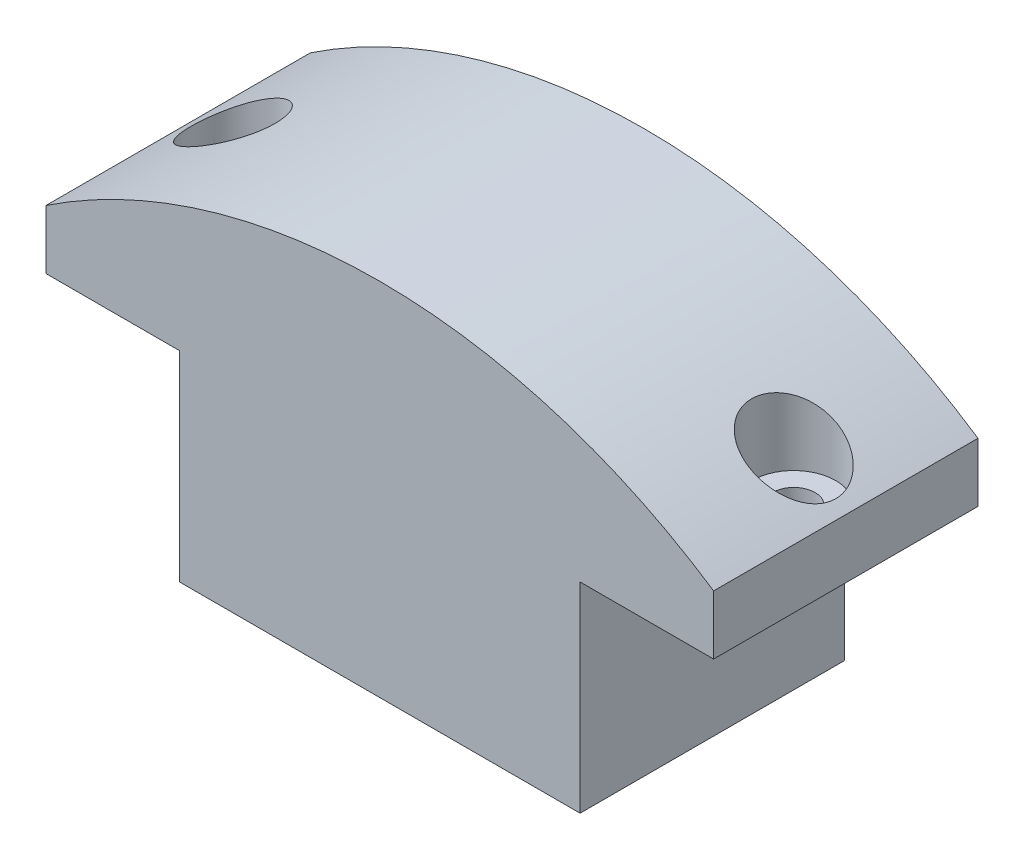
ISO-10303-21;
HEADER;
FILE_DESCRIPTION(('STEP AP214'),'2;1');
FILE_NAME('part.step','',(''),(''),'','','');
FILE_SCHEMA(('AUTOMOTIVE_DESIGN { 1 0 10303 214 1 1 1 1 }'));
ENDSEC;
DATA;
#1=APPLICATION_CONTEXT('core data for automotive mechanical design processes');
#2=APPLICATION_PROTOCOL_DEFINITION('international standard','automotive_design',2000,#1);
#3=PRODUCT_CONTEXT('',#1,'mechanical');
#4=PRODUCT('Part','Part','',(#3));
#5=PRODUCT_RELATED_PRODUCT_CATEGORY('part','',(#4));
#6=PRODUCT_DEFINITION_FORMATION('','',#4);
#7=PRODUCT_DEFINITION_CONTEXT('part definition',#1,'design');
#8=PRODUCT_DEFINITION('design','',#6,#7);
#9=PRODUCT_DEFINITION_SHAPE('','',#8);
#10=(LENGTH_UNIT() NAMED_UNIT(*) SI_UNIT(.MILLI.,.METRE.));
#11=(NAMED_UNIT(*) PLANE_ANGLE_UNIT() SI_UNIT($,.RADIAN.));
#12=(NAMED_UNIT(*) SI_UNIT($,.STERADIAN.) SOLID_ANGLE_UNIT());
#13=UNCERTAINTY_MEASURE_WITH_UNIT(LENGTH_MEASURE(1.E-05),#10,'distance_accuracy_value','');
#14=(GEOMETRIC_REPRESENTATION_CONTEXT(3) GLOBAL_UNCERTAINTY_ASSIGNED_CONTEXT((#13)) GLOBAL_UNIT_ASSIGNED_CONTEXT((#10,
#11,#12)) REPRESENTATION_CONTEXT('',''));
#15=CARTESIAN_POINT('',(0.,0.,0.));
#16=DIRECTION('',(0.,0.,1.));
#17=DIRECTION('',(1.,0.,0.));
#18=AXIS2_PLACEMENT_3D('',#15,#16,#17);
#19=CARTESIAN_POINT('',(15.,32.9965738677394,19.8));
#20=DIRECTION('',(0.,1.,0.));
#21=DIRECTION('',(0.,0.,1.));
#22=AXIS2_PLACEMENT_3D('',#19,#20,#21);
#23=PLANE('',#22);
#24=CARTESIAN_POINT('',(21.,32.9965738677394,9.8));
#25=DIRECTION('',(0.,-1.,0.));
#26=DIRECTION('',(0.,0.,-1.));
#27=AXIS2_PLACEMENT_3D('',#24,#25,#26);
#28=CIRCLE('',#27,1.6);
#29=CARTESIAN_POINT('',(21.,32.9965738677394,8.2));
#30=VERTEX_POINT('',#29);
#31=EDGE_CURVE('E135',#30,#30,#28,.T.);
#32=ORIENTED_EDGE('',*,*,#31,.F.);
#33=EDGE_LOOP('',(#32));
#34=FACE_BOUND('',#33,.T.);
#35=DIRECTION('',(1.,0.,0.));
#36=VECTOR('',#35,1.);
#37=CARTESIAN_POINT('',(15.,32.9965738677394,0.));
#38=LINE('',#37,#36);
#39=CARTESIAN_POINT('',(15.,32.9965738677394,0.));
#40=VERTEX_POINT('',#39);
#41=CARTESIAN_POINT('',(25.,32.9965738677394,0.));
#42=VERTEX_POINT('',#41);
#43=EDGE_CURVE('E131',#40,#42,#38,.T.);
#44=ORIENTED_EDGE('',*,*,#43,.T.);
#45=DIRECTION('',(0.,0.,-1.));
#46=VECTOR('',#45,1.);
#47=CARTESIAN_POINT('',(25.,32.9965738677394,19.8));
#48=LINE('',#47,#46);
#49=CARTESIAN_POINT('',(25.,32.9965738677394,19.8));
#50=VERTEX_POINT('',#49);
#51=EDGE_CURVE('E11',#50,#42,#48,.T.);
#52=ORIENTED_EDGE('',*,*,#51,.F.);
#53=DIRECTION('',(1.,0.,0.));
#54=VECTOR('',#53,1.);
#55=CARTESIAN_POINT('',(15.,32.9965738677394,19.8));
#56=LINE('',#55,#54);
#57=CARTESIAN_POINT('',(15.,32.9965738677394,19.8));
#58=VERTEX_POINT('',#57);
#59=EDGE_CURVE('E146',#58,#50,#56,.T.);
#60=ORIENTED_EDGE('',*,*,#59,.F.);
#61=DIRECTION('',(0.,0.,-1.));
#62=VECTOR('',#61,1.);
#63=CARTESIAN_POINT('',(15.,32.9965738677394,19.8));
#64=LINE('',#63,#62);
#65=EDGE_CURVE('E127',#58,#40,#64,.T.);
#66=ORIENTED_EDGE('',*,*,#65,.T.);
#67=EDGE_LOOP('',(#44,#52,#60,#66));
#68=FACE_BOUND('',#67,.T.);
#69=ADVANCED_FACE('F35',(#34,#68),#23,.F.);
#70=CARTESIAN_POINT('',(25.,32.9965738677394,19.8));
#71=DIRECTION('',(-1.,0.,0.));
#72=DIRECTION('',(0.,0.,1.));
#73=AXIS2_PLACEMENT_3D('',#70,#71,#72);
#74=PLANE('',#73);
#75=DIRECTION('',(0.,1.,0.));
#76=VECTOR('',#75,1.);
#77=CARTESIAN_POINT('',(25.,32.9965738677394,0.));
#78=LINE('',#77,#76);
#79=CARTESIAN_POINT('',(25.,37.4165738677394,0.));
#80=VERTEX_POINT('',#79);
#81=EDGE_CURVE('E134',#42,#80,#78,.T.);
#82=ORIENTED_EDGE('',*,*,#81,.T.);
#83=DIRECTION('',(0.,0.,-1.));
#84=VECTOR('',#83,1.);
#85=CARTESIAN_POINT('',(25.,37.4165738677394,19.8));
#86=LINE('',#85,#84);
#87=CARTESIAN_POINT('',(25.,37.4165738677394,19.8));
#88=VERTEX_POINT('',#87);
#89=EDGE_CURVE('E43',#88,#80,#86,.T.);
#90=ORIENTED_EDGE('',*,*,#89,.F.);
#91=DIRECTION('',(0.,1.,0.));
#92=VECTOR('',#91,1.);
#93=CARTESIAN_POINT('',(25.,32.9965738677394,19.8));
#94=LINE('',#93,#92);
#95=EDGE_CURVE('E94',#50,#88,#94,.T.);
#96=ORIENTED_EDGE('',*,*,#95,.F.);
#97=ORIENTED_EDGE('',*,*,#51,.T.);
#98=EDGE_LOOP('',(#82,#90,#96,#97));
#99=FACE_BOUND('',#98,.T.);
#100=ADVANCED_FACE('F231',(#99),#74,.F.);
#101=CARTESIAN_POINT('',(0.,0.,19.8));
#102=DIRECTION('',(0.,0.,-1.));
#103=DIRECTION('',(-1.,0.,0.));
#104=AXIS2_PLACEMENT_3D('',#101,#102,#103);
#105=CYLINDRICAL_SURFACE('',#104,45.);
#106=CARTESIAN_POINT('',(21.,39.7994974842648,6.65));
#107=CARTESIAN_POINT('',(20.8095898859352,39.8999649470763,6.65000389097572));
#108=CARTESIAN_POINT('',(20.6183845210658,39.9990918825694,6.66727919891244));
#109=CARTESIAN_POINT('',(20.239617989831,40.1920773996633,6.73708994193196));
#110=CARTESIAN_POINT('',(20.052058532874,40.2859335472036,6.78964152490448));
#111=CARTESIAN_POINT('',(19.6858810604979,40.4661324163677,6.93047045411244));
#112=CARTESIAN_POINT('',(19.5072995898889,40.552445343613,7.01888231871219));
#113=CARTESIAN_POINT('',(19.1667405389378,40.7145136257025,7.23060452824021));
#114=CARTESIAN_POINT('',(19.0047540397641,40.7902746595309,7.35389599196204));
#115=CARTESIAN_POINT('',(18.7171471744128,40.9229943805891,7.62137132301741));
#116=CARTESIAN_POINT('',(18.5896303469768,40.9809878130145,7.76299763846241));
#117=CARTESIAN_POINT('',(18.3606331805469,41.084096268551,8.07001926326375));
#118=CARTESIAN_POINT('',(18.259134402945,41.129220414503,8.2353976094964));
#119=CARTESIAN_POINT('',(18.0960107443993,41.2012326394509,8.56710581617336));
#120=CARTESIAN_POINT('',(18.0314072576366,41.2294960034061,8.73167592253253));
#121=CARTESIAN_POINT('',(17.9304578428315,41.2734994488965,9.07084612817732));
#122=CARTESIAN_POINT('',(17.8940984187113,41.2892455117542,9.24544139417858));
#123=CARTESIAN_POINT('',(17.85282654387,41.307106464312,9.58696951386784));
#124=CARTESIAN_POINT('',(17.8459581692041,41.3100692451873,9.75362473024088));
#125=CARTESIAN_POINT('',(17.8585902378111,41.3046099780169,10.0857269898179));
#126=CARTESIAN_POINT('',(17.8780858894175,41.2961899987902,10.2511742470745));
#127=CARTESIAN_POINT('',(17.9419398427271,41.2684862142254,10.5727247297576));
#128=CARTESIAN_POINT('',(17.9857885264604,41.2494250481345,10.7289491371089));
#129=CARTESIAN_POINT('',(18.0962133861545,41.2011003475935,11.031444030478));
#130=CARTESIAN_POINT('',(18.1627909139279,41.1718362063126,11.177713923824));
#131=CARTESIAN_POINT('',(18.3181512957803,41.1029525110977,11.4603805416778));
#132=CARTESIAN_POINT('',(18.4074615884912,41.0630858051202,11.5964262345901));
#133=CARTESIAN_POINT('',(18.6041413713311,40.9743522726172,11.8514166649086));
#134=CARTESIAN_POINT('',(18.7115150341686,40.9254833663003,11.9703574392098));
#135=CARTESIAN_POINT('',(18.9482774808717,40.8164280912838,12.1961185409883));
#136=CARTESIAN_POINT('',(19.0786398385717,40.7557148689957,12.3016612670698));
#137=CARTESIAN_POINT('',(19.3517620207007,40.6267415509772,12.4894820689511));
#138=CARTESIAN_POINT('',(19.4945262193779,40.5584787901145,12.5717518922697));
#139=CARTESIAN_POINT('',(19.801931149612,40.4093459886358,12.7186853006154));
#140=CARTESIAN_POINT('',(19.9673803679145,40.3278939673766,12.7810650655067));
#141=CARTESIAN_POINT('',(20.3037634370288,40.1595893867782,12.8770746065606));
#142=CARTESIAN_POINT('',(20.4746995514226,40.0727345843319,12.9106923547948));
#143=CARTESIAN_POINT('',(20.8343858715016,39.8870039742162,12.9513286858872));
#144=CARTESIAN_POINT('',(21.0232767511669,39.7877727885895,12.9554969073778));
#145=CARTESIAN_POINT('',(21.3979095664202,39.5875568262624,12.9304081281387));
#146=CARTESIAN_POINT('',(21.5836501895814,39.4865713525326,12.901137527542));
#147=CARTESIAN_POINT('',(21.9590557448664,39.2791123273102,12.8070698142125));
#148=CARTESIAN_POINT('',(22.1482240322816,39.1726963203827,12.7401398402371));
#149=CARTESIAN_POINT('',(22.5126108228531,38.9644256519712,12.5703730899714));
#150=CARTESIAN_POINT('',(22.6878226307524,38.8625731898573,12.4675192060103));
#151=CARTESIAN_POINT('',(23.0157942413747,38.6692229739673,12.2288752349749));
#152=CARTESIAN_POINT('',(23.1688726268504,38.5775838496895,12.0936475308764));
#153=CARTESIAN_POINT('',(23.3788988730589,38.4504078672754,11.8673533257102));
#154=CARTESIAN_POINT('',(23.4456304459892,38.4097371164335,11.7880322599062));
#155=CARTESIAN_POINT('',(23.5717488228706,38.3324680037352,11.6219421857591));
#156=CARTESIAN_POINT('',(23.6311383726265,38.2958681199532,11.5351759824758));
#157=CARTESIAN_POINT('',(23.7674748588578,38.2114674316841,11.312499517319));
#158=CARTESIAN_POINT('',(23.8396724928796,38.166415643574,11.172558701663));
#159=CARTESIAN_POINT('',(23.9631216649212,38.0890292154455,10.8805169159697));
#160=CARTESIAN_POINT('',(24.0143886482069,38.0566851987017,10.7284250119927));
#161=CARTESIAN_POINT('',(24.0935885885004,38.0065945527741,10.4151469421752));
#162=CARTESIAN_POINT('',(24.1214160182496,37.9889139451878,10.2539230989769));
#163=CARTESIAN_POINT('',(24.1516361745208,37.969709212294,9.92815610321511));
#164=CARTESIAN_POINT('',(24.154035345065,37.968180993653,9.7636138022048));
#165=CARTESIAN_POINT('',(24.1340917662249,37.98085973272,9.44958608787399));
#166=CARTESIAN_POINT('',(24.1136571913492,37.9938531588174,9.29992423536089));
#167=CARTESIAN_POINT('',(24.0521490113346,38.032820534756,9.00669497320493));
#168=CARTESIAN_POINT('',(24.0110747347996,38.0587949068589,8.86312776198161));
#169=CARTESIAN_POINT('',(23.9093153364898,38.1228053354404,8.58304107543369));
#170=CARTESIAN_POINT('',(23.8482965398505,38.161046397085,8.44669094328515));
#171=CARTESIAN_POINT('',(23.7093473264689,38.247529756958,8.1863923624411));
#172=CARTESIAN_POINT('',(23.6314113942455,38.2957753167158,8.06244797768354));
#173=CARTESIAN_POINT('',(23.4516024341182,38.4061798549892,7.81555889019197));
#174=CARTESIAN_POINT('',(23.3480249762151,38.4692924728894,7.69428582301394));
#175=CARTESIAN_POINT('',(23.1263339898918,38.6029720501494,7.47061419119801));
#176=CARTESIAN_POINT('',(23.0082112739578,38.6735437169912,7.36822765928233));
#177=CARTESIAN_POINT('',(22.7420322301341,38.8307507196082,7.16954038704056));
#178=CARTESIAN_POINT('',(22.5921311357471,38.9182195554417,7.07636878308871));
#179=CARTESIAN_POINT('',(22.2809561639109,39.0972022289693,6.91690584715792));
#180=CARTESIAN_POINT('',(22.1196812948052,39.1887164191094,6.85061686243017));
#181=CARTESIAN_POINT('',(21.8003490820155,39.367194177417,6.74908165989917));
#182=CARTESIAN_POINT('',(21.6427948338375,39.4540540474883,6.71205954681499));
#183=CARTESIAN_POINT('',(21.3236862286827,39.6274324402444,6.66251561966533));
#184=CARTESIAN_POINT('',(21.1621314035459,39.7139509215923,6.64999668689157));
#185=CARTESIAN_POINT('',(21.,39.7994974842648,6.65));
#186=B_SPLINE_CURVE_WITH_KNOTS('',3,(#106,#107,#108,#109,#110,#111,#112,#113,#114,#115,#116,
#117,#118,#119,#120,#121,#122,#123,#124,#125,#126,#127,#128,#129,#130,#131,#132,#133,#134,#135,
#136,#137,#138,#139,#140,#141,#142,#143,#144,#145,#146,#147,#148,#149,#150,#151,#152,#153,#154,
#155,#156,#157,#158,#159,#160,#161,#162,#163,#164,#165,#166,#167,#168,#169,#170,#171,#172,#173,
#174,#175,#176,#177,#178,#179,#180,#181,#182,#183,#184,#185),.UNSPECIFIED.,.T.,.F.,(4,2,2,2,2,2,
2,2,2,2,2,2,2,2,2,2,2,2,2,2,2,2,2,2,2,2,2,2,2,2,2,2,2,2,2,2,2,2,2,4),(0.,0.64526503181709,
1.29082563850518,1.93883059143622,2.58648543195801,3.18079082763854,3.77467387613471,
4.30898008105757,4.84303081701337,5.34105494380315,5.83898856678193,6.32687485155211,
6.81479015873039,7.31526399834464,7.81585360850799,8.34874964089259,8.88183439995838,
9.46343602500671,10.0452807501251,10.6827539966225,11.3204866015034,11.9986140777556,
12.6770649329269,13.3444907780306,13.6780636815951,14.0115114541363,14.5006476209243,
14.9894221862947,15.4803856784724,15.9712247478455,16.4239213551027,16.8766326892426,
17.3373428294864,17.7982034009255,18.3107590142745,18.8236400603776,19.412226658645,
20.0008646381884,20.5502336994233,21.099667356251),.UNSPECIFIED.);
#187=CARTESIAN_POINT('',(21.,39.7994974842648,6.65));
#188=VERTEX_POINT('',#187);
#189=EDGE_CURVE('E190',#188,#188,#186,.T.);
#190=ORIENTED_EDGE('',*,*,#189,.F.);
#191=EDGE_LOOP('',(#190));
#192=FACE_BOUND('',#191,.T.);
#193=CARTESIAN_POINT('',(-21.,39.7994974842648,6.65));
#194=CARTESIAN_POINT('',(-21.2000762304794,39.693925390096,6.65000517701143));
#195=CARTESIAN_POINT('',(-21.3995427320068,39.5867312270996,6.66908960230216));
#196=CARTESIAN_POINT('',(-21.7916375533055,39.3722577876117,6.74454717966918));
#197=CARTESIAN_POINT('',(-21.9842515561346,39.2649787626328,6.80099406593969));
#198=CARTESIAN_POINT('',(-22.3571824400149,39.0538390987263,6.95027214750927));
#199=CARTESIAN_POINT('',(-22.5374871618129,38.9499818908302,7.04313872508007));
#200=CARTESIAN_POINT('',(-22.8799338619514,38.7498113371353,7.26429728079227));
#201=CARTESIAN_POINT('',(-23.0420831630593,38.6534949545855,7.39257490344719));
#202=CARTESIAN_POINT('',(-23.2626932709291,38.5208263834669,7.60625241164135));
#203=CARTESIAN_POINT('',(-23.3308987088608,38.4795398417869,7.67880737939833));
#204=CARTESIAN_POINT('',(-23.4609109177943,38.4004091169562,7.83113632230924));
#205=CARTESIAN_POINT('',(-23.5227216762578,38.3625627904364,7.91090573994605));
#206=CARTESIAN_POINT('',(-23.639082021341,38.2909711922091,8.07719966197368));
#207=CARTESIAN_POINT('',(-23.6936368047434,38.2572229869208,8.16371926060098));
#208=CARTESIAN_POINT('',(-23.7946661793577,38.1944681630586,8.34297662271305));
#209=CARTESIAN_POINT('',(-23.8411426449984,38.1654604446335,8.43571293678188));
#210=CARTESIAN_POINT('',(-23.918976409525,38.1167201757075,8.61256949512267));
#211=CARTESIAN_POINT('',(-23.9515519269615,38.0962509976715,8.69595222183619));
#212=CARTESIAN_POINT('',(-24.0096983101216,38.0596317409687,8.86603511582528));
#213=CARTESIAN_POINT('',(-24.0352706500703,38.0434807533052,8.9527345805145));
#214=CARTESIAN_POINT('',(-24.0789558852541,38.0158461231321,9.12863646712249));
#215=CARTESIAN_POINT('',(-24.097076310852,38.0043577690585,9.21783626450967));
#216=CARTESIAN_POINT('',(-24.1255650070427,37.9862789195112,9.39792035875621));
#217=CARTESIAN_POINT('',(-24.1359343801123,37.9796877274866,9.48880441416858));
#218=CARTESIAN_POINT('',(-24.1532109396805,37.9687062120821,9.73599920891304));
#219=CARTESIAN_POINT('',(-24.1524927151476,37.9691630229933,9.89315736284045));
#220=CARTESIAN_POINT('',(-24.127800190305,37.9848580502089,10.2047593019726));
#221=CARTESIAN_POINT('',(-24.1038307427956,38.0000931821062,10.3592036467329));
#222=CARTESIAN_POINT('',(-24.0353524526376,38.0434407060076,10.655174056044));
#223=CARTESIAN_POINT('',(-23.9916650102539,38.0710378137485,10.7969683174311));
#224=CARTESIAN_POINT('',(-23.8860399295901,38.1373959039776,11.0707584407513));
#225=CARTESIAN_POINT('',(-23.8240984300753,38.1761592483927,11.2027522222107));
#226=CARTESIAN_POINT('',(-23.6788685764766,38.2664215698969,11.4644092305381));
#227=CARTESIAN_POINT('',(-23.5942959218804,38.3186758560263,11.5930952508536));
#228=CARTESIAN_POINT('',(-23.4096304503662,38.431769781733,11.8345307615273));
#229=CARTESIAN_POINT('',(-23.3095301810927,38.4926135424931,11.9472725496465));
#230=CARTESIAN_POINT('',(-23.0816143465023,38.6297697188911,12.1702802208745));
#231=CARTESIAN_POINT('',(-22.9518806376556,38.7070550494267,12.2779862959582));
#232=CARTESIAN_POINT('',(-22.67941327718,38.8673287103038,12.4701885788348));
#233=CARTESIAN_POINT('',(-22.5366724170577,38.9503201966358,12.5546718112056));
#234=CARTESIAN_POINT('',(-22.220961826293,39.1313979573861,12.7097757292571));
#235=CARTESIAN_POINT('',(-22.0465402675023,39.2299856315958,12.7768688223527));
#236=CARTESIAN_POINT('',(-21.6893343848884,39.4286011115531,12.8792635415301));
#237=CARTESIAN_POINT('',(-21.5065461073564,39.5286295825272,12.9145499708874));
#238=CARTESIAN_POINT('',(-21.1230571359432,39.7349633801912,12.9539263021121));
#239=CARTESIAN_POINT('',(-20.9220415757833,39.8411764613225,12.9554765172324));
#240=CARTESIAN_POINT('',(-20.5209388549562,40.0492445727389,12.9198505014424));
#241=CARTESIAN_POINT('',(-20.3208517620737,40.1510992891595,12.8826714863454));
#242=CARTESIAN_POINT('',(-20.0282928054916,40.2973852175548,12.7980660094877));
#243=CARTESIAN_POINT('',(-19.9327898003661,40.3447015138544,12.7654408797754));
#244=CARTESIAN_POINT('',(-19.7444925148192,40.4371854913723,12.6907509350966));
#245=CARTESIAN_POINT('',(-19.6516969198334,40.4823542222669,12.6486907904285));
#246=CARTESIAN_POINT('',(-19.4696987641818,40.5701990980977,12.5552040334821));
#247=CARTESIAN_POINT('',(-19.3804965902275,40.6128749749828,12.5037764163803));
#248=CARTESIAN_POINT('',(-19.2066954544945,40.6953571427575,12.3917633925724));
#249=CARTESIAN_POINT('',(-19.122093844343,40.7351650889888,12.3311833321326));
#250=CARTESIAN_POINT('',(-18.9655504185947,40.8082676000096,12.2067873582371));
#251=CARTESIAN_POINT('',(-18.893147007321,40.841827629915,12.1437078278032));
#252=CARTESIAN_POINT('',(-18.7537886803641,40.9060055727443,12.0105024325336));
#253=CARTESIAN_POINT('',(-18.6868308301621,40.9366250718998,11.9403804089237));
#254=CARTESIAN_POINT('',(-18.5591211891538,40.9946818766116,11.7935073259992));
#255=CARTESIAN_POINT('',(-18.4983673679848,41.0221202236487,11.716758450696));
#256=CARTESIAN_POINT('',(-18.3838216688745,41.0735808321962,11.5572054770158));
#257=CARTESIAN_POINT('',(-18.3300290516201,41.0976034564996,11.4744020231284));
#258=CARTESIAN_POINT('',(-18.190586679916,41.1595939188903,11.2356469774811));
#259=CARTESIAN_POINT('',(-18.1133416518532,41.1935860046871,11.0735858755049));
#260=CARTESIAN_POINT('',(-17.9871809431019,41.2488318907973,10.7368815713821));
#261=CARTESIAN_POINT('',(-17.9382499861279,41.2700925603056,10.5622452112612));
#262=CARTESIAN_POINT('',(-17.8735964275075,41.2981317506074,10.2196790082862));
#263=CARTESIAN_POINT('',(-17.8556277289959,41.3058902465789,10.0522519394047));
#264=CARTESIAN_POINT('',(-17.846634462019,41.3097769997292,9.71656303420712));
#265=CARTESIAN_POINT('',(-17.8556034853234,41.305908022974,9.54830140593214));
#266=CARTESIAN_POINT('',(-17.8993998793067,41.2869472159255,9.2210112513455));
#267=CARTESIAN_POINT('',(-17.9334445736454,41.2721950559126,9.06185713030102));
#268=CARTESIAN_POINT('',(-18.025092082695,41.2322511369645,8.75188402299124));
#269=CARTESIAN_POINT('',(-18.0826954399472,41.2070591376061,8.60106522877411));
#270=CARTESIAN_POINT('',(-18.2203860347075,41.1463638391491,8.30911568124875));
#271=CARTESIAN_POINT('',(-18.3008366943261,41.1106935217871,8.16819165676974));
#272=CARTESIAN_POINT('',(-18.4808166663035,41.0301000955772,7.90209753965783));
#273=CARTESIAN_POINT('',(-18.5803488364649,40.9851756006729,7.77692981147414));
#274=CARTESIAN_POINT('',(-18.8013542650603,40.8842833861893,7.53804793953347));
#275=CARTESIAN_POINT('',(-18.9237583369744,40.8278301761554,7.42540198430491));
#276=CARTESIAN_POINT('',(-19.1822376116596,40.7070278464233,7.22215089522985));
#277=CARTESIAN_POINT('',(-19.3183210221308,40.6426739810896,7.13155910692179));
#278=CARTESIAN_POINT('',(-19.6126114496026,40.5015351707658,6.96652984919645));
#279=CARTESIAN_POINT('',(-19.7717123251466,40.4241551685417,6.89420076704097));
#280=CARTESIAN_POINT('',(-20.096794126691,40.2635278653936,6.77733102605772));
#281=CARTESIAN_POINT('',(-20.2627692968873,40.1802854337146,6.73276760152361));
#282=CARTESIAN_POINT('',(-20.5246135084304,40.0468669870016,6.68459373731107));
#283=CARTESIAN_POINT('',(-20.6195621185938,39.998063898242,6.67160097189693));
#284=CARTESIAN_POINT('',(-20.8097197154986,39.8994617625106,6.65430301549888));
#285=CARTESIAN_POINT('',(-20.9049286936108,39.8496627482086,6.64999754001144));
#286=CARTESIAN_POINT('',(-21.,39.7994974842648,6.65));
#287=B_SPLINE_CURVE_WITH_KNOTS('',3,(#193,#194,#195,#196,#197,#198,#199,#200,#201,#202,#203,
#204,#205,#206,#207,#208,#209,#210,#211,#212,#213,#214,#215,#216,#217,#218,#219,#220,#221,#222,
#223,#224,#225,#226,#227,#228,#229,#230,#231,#232,#233,#234,#235,#236,#237,#238,#239,#240,#241,
#242,#243,#244,#245,#246,#247,#248,#249,#250,#251,#252,#253,#254,#255,#256,#257,#258,#259,#260,
#261,#262,#263,#264,#265,#266,#267,#268,#269,#270,#271,#272,#273,#274,#275,#276,#277,#278,#279,
#280,#281,#282,#283,#284,#285,#286),.UNSPECIFIED.,.T.,.F.,(4,2,2,2,2,2,2,2,2,2,2,2,2,2,2,2,2,2,
2,2,2,2,2,2,2,2,2,2,2,2,2,2,2,2,2,2,2,2,2,2,2,2,2,2,2,2,4),(0.,0.678273479770231,
1.35788952789973,2.03816747530657,2.71817004491791,3.04117711637448,3.36398154415211,
3.68655351756731,4.00905054373257,4.28413807207595,4.55916764769153,4.8339186114048,
5.10863048826346,5.57748065379345,6.04623298589941,6.49704088400315,6.94794420889276,
7.43386767207192,7.92002507608011,8.47429365739799,9.02887130154879,9.66006509300796,
10.2915602993457,10.9704429299168,11.6493743677142,11.9833935953554,12.3172478480998,
12.6511379336067,12.9848337308368,13.2895869104699,13.5941747604444,13.898662607785,
14.2031180904681,14.7480927876107,15.2927731798462,15.7959545343221,16.2990161961791,
16.7870078527085,17.2750107480136,17.7712584359569,18.2675805041485,18.7923598349767,
19.3174559381796,19.8885191267907,20.4591134691485,20.7814229088227,21.103721792885),.UNSPECIFIED.);
#288=CARTESIAN_POINT('',(-21.,39.7994974842648,6.65));
#289=VERTEX_POINT('',#288);
#290=EDGE_CURVE('E191',#289,#289,#287,.T.);
#291=ORIENTED_EDGE('',*,*,#290,.F.);
#292=EDGE_LOOP('',(#291));
#293=FACE_BOUND('',#292,.T.);
#294=CARTESIAN_POINT('',(0.,0.,0.));
#295=DIRECTION('',(0.,0.,1.));
#296=DIRECTION('',(1.,0.,0.));
#297=AXIS2_PLACEMENT_3D('',#294,#295,#296);
#298=CIRCLE('',#297,45.);
#299=CARTESIAN_POINT('',(-25.,37.4165738677394,0.));
#300=VERTEX_POINT('',#299);
#301=EDGE_CURVE('E137',#80,#300,#298,.T.);
#302=ORIENTED_EDGE('',*,*,#301,.T.);
#303=DIRECTION('',(0.,0.,-1.));
#304=VECTOR('',#303,1.);
#305=CARTESIAN_POINT('',(-25.,37.4165738677394,19.8));
#306=LINE('',#305,#304);
#307=CARTESIAN_POINT('',(-25.,37.4165738677394,19.8));
#308=VERTEX_POINT('',#307);
#309=EDGE_CURVE('E153',#308,#300,#306,.T.);
#310=ORIENTED_EDGE('',*,*,#309,.F.);
#311=CARTESIAN_POINT('',(0.,0.,19.8));
#312=DIRECTION('',(0.,0.,1.));
#313=DIRECTION('',(1.,0.,0.));
#314=AXIS2_PLACEMENT_3D('',#311,#312,#313);
#315=CIRCLE('',#314,45.);
#316=EDGE_CURVE('E161',#88,#308,#315,.T.);
#317=ORIENTED_EDGE('',*,*,#316,.F.);
#318=ORIENTED_EDGE('',*,*,#89,.T.);
#319=EDGE_LOOP('',(#302,#310,#317,#318));
#320=FACE_BOUND('',#319,.T.);
#321=ADVANCED_FACE('F159',(#192,#293,#320),#105,.T.);
#322=CARTESIAN_POINT('',(-25.,37.4165738677394,19.8));
#323=DIRECTION('',(1.,0.,0.));
#324=DIRECTION('',(0.,0.,-1.));
#325=AXIS2_PLACEMENT_3D('',#322,#323,#324);
#326=PLANE('',#325);
#327=DIRECTION('',(0.,-1.,0.));
#328=VECTOR('',#327,1.);
#329=CARTESIAN_POINT('',(-25.,37.4165738677394,0.));
#330=LINE('',#329,#328);
#331=CARTESIAN_POINT('',(-25.,32.9965738677394,0.));
#332=VERTEX_POINT('',#331);
#333=EDGE_CURVE('E139',#300,#332,#330,.T.);
#334=ORIENTED_EDGE('',*,*,#333,.T.);
#335=DIRECTION('',(0.,0.,-1.));
#336=VECTOR('',#335,1.);
#337=CARTESIAN_POINT('',(-25.,32.9965738677394,19.8));
#338=LINE('',#337,#336);
#339=CARTESIAN_POINT('',(-25.,32.9965738677394,19.8));
#340=VERTEX_POINT('',#339);
#341=EDGE_CURVE('E150',#340,#332,#338,.T.);
#342=ORIENTED_EDGE('',*,*,#341,.F.);
#343=DIRECTION('',(0.,-1.,0.));
#344=VECTOR('',#343,1.);
#345=CARTESIAN_POINT('',(-25.,37.4165738677394,19.8));
#346=LINE('',#345,#344);
#347=EDGE_CURVE('E173',#308,#340,#346,.T.);
#348=ORIENTED_EDGE('',*,*,#347,.F.);
#349=ORIENTED_EDGE('',*,*,#309,.T.);
#350=EDGE_LOOP('',(#334,#342,#348,#349));
#351=FACE_BOUND('',#350,.T.);
#352=ADVANCED_FACE('F169',(#351),#326,.F.);
#353=CARTESIAN_POINT('',(-25.,32.9965738677394,19.8));
#354=DIRECTION('',(0.,1.,0.));
#355=DIRECTION('',(0.,0.,1.));
#356=AXIS2_PLACEMENT_3D('',#353,#354,#355);
#357=PLANE('',#356);
#358=CARTESIAN_POINT('',(-21.,32.9965738677394,9.8));
#359=DIRECTION('',(0.,-1.,0.));
#360=DIRECTION('',(0.,0.,-1.));
#361=AXIS2_PLACEMENT_3D('',#358,#359,#360);
#362=CIRCLE('',#361,1.6);
#363=CARTESIAN_POINT('',(-21.,32.9965738677394,8.2));
#364=VERTEX_POINT('',#363);
#365=EDGE_CURVE('E179',#364,#364,#362,.T.);
#366=ORIENTED_EDGE('',*,*,#365,.F.);
#367=EDGE_LOOP('',(#366));
#368=FACE_BOUND('',#367,.T.);
#369=DIRECTION('',(1.,0.,0.));
#370=VECTOR('',#369,1.);
#371=CARTESIAN_POINT('',(-25.,32.9965738677394,0.));
#372=LINE('',#371,#370);
#373=CARTESIAN_POINT('',(-15.,32.9965738677394,0.));
#374=VERTEX_POINT('',#373);
#375=EDGE_CURVE('E141',#332,#374,#372,.T.);
#376=ORIENTED_EDGE('',*,*,#375,.T.);
#377=DIRECTION('',(0.,0.,-1.));
#378=VECTOR('',#377,1.);
#379=CARTESIAN_POINT('',(-15.,32.9965738677394,19.8));
#380=LINE('',#379,#378);
#381=CARTESIAN_POINT('',(-15.,32.9965738677394,19.8));
#382=VERTEX_POINT('',#381);
#383=EDGE_CURVE('E122',#382,#374,#380,.T.);
#384=ORIENTED_EDGE('',*,*,#383,.F.);
#385=DIRECTION('',(1.,0.,0.));
#386=VECTOR('',#385,1.);
#387=CARTESIAN_POINT('',(-25.,32.9965738677394,19.8));
#388=LINE('',#387,#386);
#389=EDGE_CURVE('E113',#340,#382,#388,.T.);
#390=ORIENTED_EDGE('',*,*,#389,.F.);
#391=ORIENTED_EDGE('',*,*,#341,.T.);
#392=EDGE_LOOP('',(#376,#384,#390,#391));
#393=FACE_BOUND('',#392,.T.);
#394=ADVANCED_FACE('F172',(#368,#393),#357,.F.);
#395=CARTESIAN_POINT('',(-15.,17.9965738677394,19.8));
#396=DIRECTION('',(1.,0.,0.));
#397=DIRECTION('',(0.,0.,-1.));
#398=AXIS2_PLACEMENT_3D('',#395,#396,#397);
#399=PLANE('',#398);
#400=DIRECTION('',(0.,-1.,0.));
#401=VECTOR('',#400,1.);
#402=CARTESIAN_POINT('',(-15.,17.9965738677394,0.));
#403=LINE('',#402,#401);
#404=CARTESIAN_POINT('',(-15.,17.9965738677394,0.));
#405=VERTEX_POINT('',#404);
#406=EDGE_CURVE('E121',#374,#405,#403,.T.);
#407=ORIENTED_EDGE('',*,*,#406,.T.);
#408=DIRECTION('',(0.,0.,-1.));
#409=VECTOR('',#408,1.);
#410=CARTESIAN_POINT('',(-15.,17.9965738677394,19.8));
#411=LINE('',#410,#409);
#412=CARTESIAN_POINT('',(-15.,17.9965738677394,19.8));
#413=VERTEX_POINT('',#412);
#414=EDGE_CURVE('E118',#413,#405,#411,.T.);
#415=ORIENTED_EDGE('',*,*,#414,.F.);
#416=DIRECTION('',(0.,-1.,0.));
#417=VECTOR('',#416,1.);
#418=CARTESIAN_POINT('',(-15.,17.9965738677394,19.8));
#419=LINE('',#418,#417);
#420=EDGE_CURVE('E107',#382,#413,#419,.T.);
#421=ORIENTED_EDGE('',*,*,#420,.F.);
#422=ORIENTED_EDGE('',*,*,#383,.T.);
#423=EDGE_LOOP('',(#407,#415,#421,#422));
#424=FACE_BOUND('',#423,.T.);
#425=ADVANCED_FACE('F119',(#424),#399,.F.);
#426=CARTESIAN_POINT('',(15.,17.9965738677394,19.8));
#427=DIRECTION('',(0.,1.,0.));
#428=DIRECTION('',(-1.,0.,0.));
#429=AXIS2_PLACEMENT_3D('',#426,#427,#428);
#430=PLANE('',#429);
#431=DIRECTION('',(1.,0.,0.));
#432=VECTOR('',#431,1.);
#433=CARTESIAN_POINT('',(15.,17.9965738677394,0.));
#434=LINE('',#433,#432);
#435=CARTESIAN_POINT('',(15.,17.9965738677394,0.));
#436=VERTEX_POINT('',#435);
#437=EDGE_CURVE('E80',#405,#436,#434,.T.);
#438=ORIENTED_EDGE('',*,*,#437,.T.);
#439=DIRECTION('',(0.,0.,-1.));
#440=VECTOR('',#439,1.);
#441=CARTESIAN_POINT('',(15.,17.9965738677394,19.8));
#442=LINE('',#441,#440);
#443=CARTESIAN_POINT('',(15.,17.9965738677394,19.8));
#444=VERTEX_POINT('',#443);
#445=EDGE_CURVE('E123',#444,#436,#442,.T.);
#446=ORIENTED_EDGE('',*,*,#445,.F.);
#447=DIRECTION('',(1.,0.,0.));
#448=VECTOR('',#447,1.);
#449=CARTESIAN_POINT('',(15.,17.9965738677394,19.8));
#450=LINE('',#449,#448);
#451=EDGE_CURVE('E111',#413,#444,#450,.T.);
#452=ORIENTED_EDGE('',*,*,#451,.F.);
#453=ORIENTED_EDGE('',*,*,#414,.T.);
#454=EDGE_LOOP('',(#438,#446,#452,#453));
#455=FACE_BOUND('',#454,.T.);
#456=ADVANCED_FACE('F125',(#455),#430,.F.);
#457=CARTESIAN_POINT('',(15.,32.9965738677394,19.8));
#458=DIRECTION('',(-1.,0.,0.));
#459=DIRECTION('',(0.,-1.,0.));
#460=AXIS2_PLACEMENT_3D('',#457,#458,#459);
#461=PLANE('',#460);
#462=DIRECTION('',(0.,1.,0.));
#463=VECTOR('',#462,1.);
#464=CARTESIAN_POINT('',(15.,32.9965738677394,0.));
#465=LINE('',#464,#463);
#466=EDGE_CURVE('E86',#436,#40,#465,.T.);
#467=ORIENTED_EDGE('',*,*,#466,.T.);
#468=ORIENTED_EDGE('',*,*,#65,.F.);
#469=DIRECTION('',(0.,1.,0.));
#470=VECTOR('',#469,1.);
#471=CARTESIAN_POINT('',(15.,32.9965738677394,19.8));
#472=LINE('',#471,#470);
#473=EDGE_CURVE('E51',#444,#58,#472,.T.);
#474=ORIENTED_EDGE('',*,*,#473,.F.);
#475=ORIENTED_EDGE('',*,*,#445,.T.);
#476=EDGE_LOOP('',(#467,#468,#474,#475));
#477=FACE_BOUND('',#476,.T.);
#478=ADVANCED_FACE('F216',(#477),#461,.F.);
#479=CARTESIAN_POINT('',(0.,0.,19.8));
#480=DIRECTION('',(0.,0.,1.));
#481=DIRECTION('',(1.,0.,0.));
#482=AXIS2_PLACEMENT_3D('',#479,#480,#481);
#483=PLANE('',#482);
#484=ORIENTED_EDGE('',*,*,#59,.T.);
#485=ORIENTED_EDGE('',*,*,#95,.T.);
#486=ORIENTED_EDGE('',*,*,#316,.T.);
#487=ORIENTED_EDGE('',*,*,#347,.T.);
#488=ORIENTED_EDGE('',*,*,#389,.T.);
#489=ORIENTED_EDGE('',*,*,#420,.T.);
#490=ORIENTED_EDGE('',*,*,#451,.T.);
#491=ORIENTED_EDGE('',*,*,#473,.T.);
#492=EDGE_LOOP('',(#484,#485,#486,#487,#488,#489,#490,#491));
#493=FACE_BOUND('',#492,.T.);
#494=ADVANCED_FACE('F109',(#493),#483,.T.);
#495=CARTESIAN_POINT('',(0.,0.,0.));
#496=DIRECTION('',(0.,0.,1.));
#497=DIRECTION('',(1.,0.,0.));
#498=AXIS2_PLACEMENT_3D('',#495,#496,#497);
#499=PLANE('',#498);
#500=ORIENTED_EDGE('',*,*,#43,.F.);
#501=ORIENTED_EDGE('',*,*,#466,.F.);
#502=ORIENTED_EDGE('',*,*,#437,.F.);
#503=ORIENTED_EDGE('',*,*,#406,.F.);
#504=ORIENTED_EDGE('',*,*,#375,.F.);
#505=ORIENTED_EDGE('',*,*,#333,.F.);
#506=ORIENTED_EDGE('',*,*,#301,.F.);
#507=ORIENTED_EDGE('',*,*,#81,.F.);
#508=EDGE_LOOP('',(#500,#501,#502,#503,#504,#505,#506,#507));
#509=FACE_BOUND('',#508,.T.);
#510=ADVANCED_FACE('F165',(#509),#499,.F.);
#511=CARTESIAN_POINT('',(-21.,35.9965738677394,9.8));
#512=DIRECTION('',(0.,-1.,0.));
#513=DIRECTION('',(0.,0.,-1.));
#514=AXIS2_PLACEMENT_3D('',#511,#512,#513);
#515=CYLINDRICAL_SURFACE('',#514,1.6);
#516=CARTESIAN_POINT('',(-21.,35.9965738677394,9.8));
#517=DIRECTION('',(0.,-1.,0.));
#518=DIRECTION('',(0.,0.,-1.));
#519=AXIS2_PLACEMENT_3D('',#516,#517,#518);
#520=CIRCLE('',#519,1.6);
#521=CARTESIAN_POINT('',(-21.,35.9965738677394,8.2));
#522=VERTEX_POINT('',#521);
#523=EDGE_CURVE('E182',#522,#522,#520,.T.);
#524=ORIENTED_EDGE('',*,*,#523,.F.);
#525=EDGE_LOOP('',(#524));
#526=FACE_BOUND('',#525,.T.);
#527=ORIENTED_EDGE('',*,*,#365,.T.);
#528=EDGE_LOOP('',(#527));
#529=FACE_BOUND('',#528,.T.);
#530=ADVANCED_FACE('F209',(#526,#529),#515,.F.);
#531=CARTESIAN_POINT('',(21.,35.9965738677394,9.8));
#532=DIRECTION('',(0.,-1.,0.));
#533=DIRECTION('',(0.,0.,-1.));
#534=AXIS2_PLACEMENT_3D('',#531,#532,#533);
#535=CYLINDRICAL_SURFACE('',#534,1.6);
#536=CARTESIAN_POINT('',(21.,35.9965738677394,9.8));
#537=DIRECTION('',(0.,-1.,0.));
#538=DIRECTION('',(0.,0.,-1.));
#539=AXIS2_PLACEMENT_3D('',#536,#537,#538);
#540=CIRCLE('',#539,1.6);
#541=CARTESIAN_POINT('',(21.,35.9965738677394,8.2));
#542=VERTEX_POINT('',#541);
#543=EDGE_CURVE('E185',#542,#542,#540,.T.);
#544=ORIENTED_EDGE('',*,*,#543,.F.);
#545=EDGE_LOOP('',(#544));
#546=FACE_BOUND('',#545,.T.);
#547=ORIENTED_EDGE('',*,*,#31,.T.);
#548=EDGE_LOOP('',(#547));
#549=FACE_BOUND('',#548,.T.);
#550=ADVANCED_FACE('F206',(#546,#549),#535,.F.);
#551=CARTESIAN_POINT('',(-21.,45.001,9.8));
#552=DIRECTION('',(0.,-1.,0.));
#553=DIRECTION('',(0.,0.,-1.));
#554=AXIS2_PLACEMENT_3D('',#551,#552,#553);
#555=CYLINDRICAL_SURFACE('',#554,3.15);
#556=ORIENTED_EDGE('',*,*,#290,.T.);
#557=EDGE_LOOP('',(#556));
#558=FACE_BOUND('',#557,.T.);
#559=CARTESIAN_POINT('',(-21.,35.9965738677394,9.8));
#560=DIRECTION('',(0.,-1.,0.));
#561=DIRECTION('',(0.,0.,-1.));
#562=AXIS2_PLACEMENT_3D('',#559,#560,#561);
#563=CIRCLE('',#562,3.15);
#564=CARTESIAN_POINT('',(-21.,35.9965738677394,6.65));
#565=VERTEX_POINT('',#564);
#566=EDGE_CURVE('E199',#565,#565,#563,.T.);
#567=ORIENTED_EDGE('',*,*,#566,.T.);
#568=EDGE_LOOP('',(#567));
#569=FACE_BOUND('',#568,.T.);
#570=ADVANCED_FACE('F201',(#558,#569),#555,.F.);
#571=CARTESIAN_POINT('',(-21.,35.9965738677394,9.8));
#572=DIRECTION('',(0.,-1.,0.));
#573=DIRECTION('',(0.,0.,-1.));
#574=AXIS2_PLACEMENT_3D('',#571,#572,#573);
#575=PLANE('',#574);
#576=ORIENTED_EDGE('',*,*,#523,.T.);
#577=EDGE_LOOP('',(#576));
#578=FACE_BOUND('',#577,.T.);
#579=ORIENTED_EDGE('',*,*,#566,.F.);
#580=EDGE_LOOP('',(#579));
#581=FACE_BOUND('',#580,.T.);
#582=ADVANCED_FACE('F285',(#578,#581),#575,.F.);
#583=CARTESIAN_POINT('',(21.,45.001,9.8));
#584=DIRECTION('',(0.,-1.,0.));
#585=DIRECTION('',(0.,0.,-1.));
#586=AXIS2_PLACEMENT_3D('',#583,#584,#585);
#587=CYLINDRICAL_SURFACE('',#586,3.15);
#588=ORIENTED_EDGE('',*,*,#189,.T.);
#589=EDGE_LOOP('',(#588));
#590=FACE_BOUND('',#589,.T.);
#591=CARTESIAN_POINT('',(21.,35.9965738677394,9.8));
#592=DIRECTION('',(0.,-1.,0.));
#593=DIRECTION('',(0.,0.,-1.));
#594=AXIS2_PLACEMENT_3D('',#591,#592,#593);
#595=CIRCLE('',#594,3.15);
#596=CARTESIAN_POINT('',(21.,35.9965738677394,6.65));
#597=VERTEX_POINT('',#596);
#598=EDGE_CURVE('E198',#597,#597,#595,.T.);
#599=ORIENTED_EDGE('',*,*,#598,.T.);
#600=EDGE_LOOP('',(#599));
#601=FACE_BOUND('',#600,.T.);
#602=ADVANCED_FACE('F294',(#590,#601),#587,.F.);
#603=CARTESIAN_POINT('',(21.,35.9965738677394,9.8));
#604=DIRECTION('',(0.,-1.,0.));
#605=DIRECTION('',(0.,0.,-1.));
#606=AXIS2_PLACEMENT_3D('',#603,#604,#605);
#607=PLANE('',#606);
#608=ORIENTED_EDGE('',*,*,#543,.T.);
#609=EDGE_LOOP('',(#608));
#610=FACE_BOUND('',#609,.T.);
#611=ORIENTED_EDGE('',*,*,#598,.F.);
#612=EDGE_LOOP('',(#611));
#613=FACE_BOUND('',#612,.T.);
#614=ADVANCED_FACE('F303',(#610,#613),#607,.F.);
#615=CLOSED_SHELL('',(#69,#100,#321,#352,#394,#425,#456,#478,#494,#510,#530,#550,#570,#582,#602,#614));
#616=MANIFOLD_SOLID_BREP('B2',#615);
#617=ADVANCED_BREP_SHAPE_REPRESENTATION('',(#18,#616),#14);
#618=SHAPE_DEFINITION_REPRESENTATION(#9,#617);
ENDSEC;
END-ISO-10303-21;
